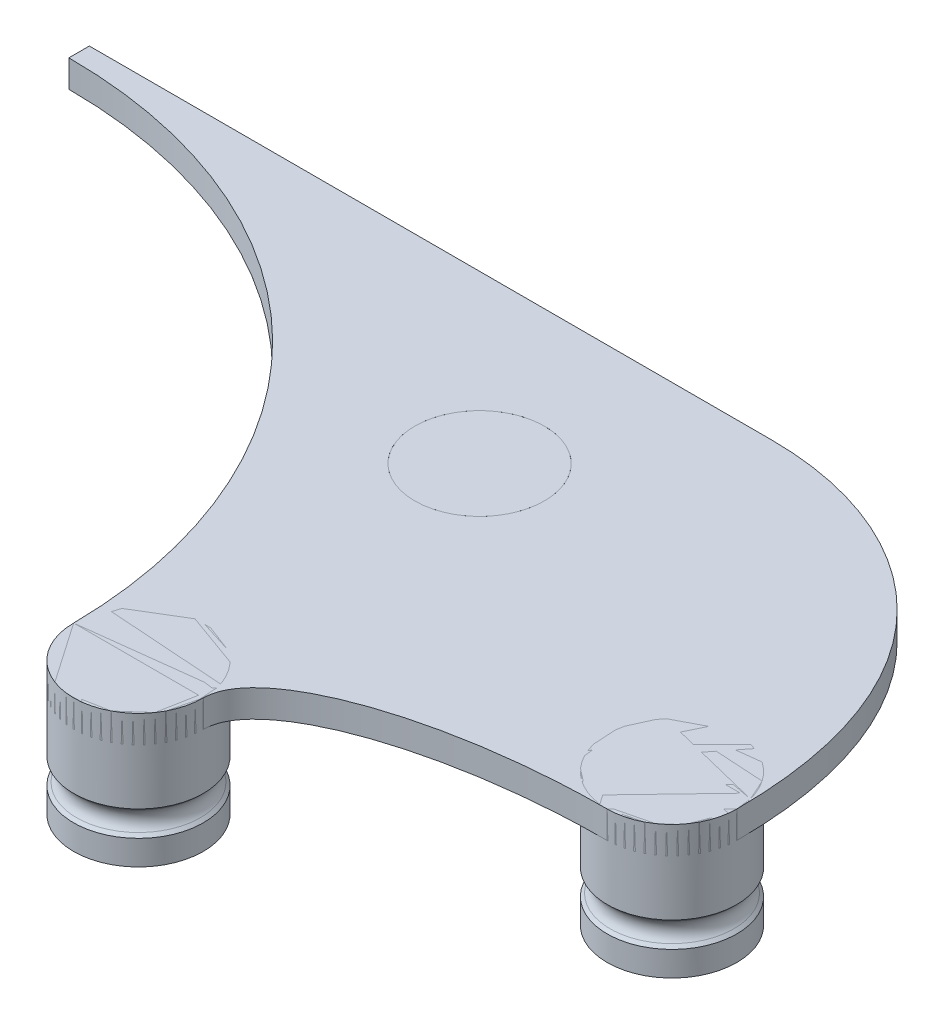
ISO-10303-21;
HEADER;
FILE_DESCRIPTION(('STEP AP214'),'2;1');
FILE_NAME('part.step','',(''),(''),'','','');
FILE_SCHEMA(('AUTOMOTIVE_DESIGN { 1 0 10303 214 1 1 1 1 }'));
ENDSEC;
DATA;
#1=APPLICATION_CONTEXT('core data for automotive mechanical design processes');
#2=APPLICATION_PROTOCOL_DEFINITION('international standard','automotive_design',2000,#1);
#3=PRODUCT_CONTEXT('',#1,'mechanical');
#4=PRODUCT('Part','Part','',(#3));
#5=PRODUCT_RELATED_PRODUCT_CATEGORY('part','',(#4));
#6=PRODUCT_DEFINITION_FORMATION('','',#4);
#7=PRODUCT_DEFINITION_CONTEXT('part definition',#1,'design');
#8=PRODUCT_DEFINITION('design','',#6,#7);
#9=PRODUCT_DEFINITION_SHAPE('','',#8);
#10=(LENGTH_UNIT() NAMED_UNIT(*) SI_UNIT(.MILLI.,.METRE.));
#11=(NAMED_UNIT(*) PLANE_ANGLE_UNIT() SI_UNIT($,.RADIAN.));
#12=(NAMED_UNIT(*) SI_UNIT($,.STERADIAN.) SOLID_ANGLE_UNIT());
#13=UNCERTAINTY_MEASURE_WITH_UNIT(LENGTH_MEASURE(1.E-05),#10,'distance_accuracy_value','');
#14=(GEOMETRIC_REPRESENTATION_CONTEXT(3) GLOBAL_UNCERTAINTY_ASSIGNED_CONTEXT((#13)) GLOBAL_UNIT_ASSIGNED_CONTEXT((#10,
#11,#12)) REPRESENTATION_CONTEXT('',''));
#15=CARTESIAN_POINT('',(0.,0.,0.));
#16=DIRECTION('',(0.,0.,1.));
#17=DIRECTION('',(1.,0.,0.));
#18=AXIS2_PLACEMENT_3D('',#15,#16,#17);
#19=CARTESIAN_POINT('',(-8.20000000000003,15.5,-49.4));
#20=CARTESIAN_POINT('',(13.9179916709351,15.5,-49.4));
#21=CARTESIAN_POINT('',(36.1,15.5,-33.7578396289594));
#22=CARTESIAN_POINT('',(36.1,15.5,0.));
#23=B_SPLINE_CURVE_WITH_KNOTS('',3,(#19,#20,#21,#22),.UNSPECIFIED.,.F.,.F.,(4,4),(0.,1.),.UNSPECIFIED.);
#24=DIRECTION('',(0.,1.,0.));
#25=VECTOR('',#24,1.);
#26=SURFACE_OF_LINEAR_EXTRUSION('',#23,#25);
#27=CARTESIAN_POINT('',(-8.20000000000003,19.5,-49.4));
#28=CARTESIAN_POINT('',(13.9179916709351,19.5,-49.4));
#29=CARTESIAN_POINT('',(36.1,19.5,-33.7578396289594));
#30=CARTESIAN_POINT('',(36.1,19.5,0.));
#31=B_SPLINE_CURVE_WITH_KNOTS('',3,(#27,#28,#29,#30),.UNSPECIFIED.,.F.,.F.,(4,4),(0.,1.),.UNSPECIFIED.);
#32=CARTESIAN_POINT('',(-8.20000000000002,19.5,-49.4));
#33=VERTEX_POINT('',#32);
#34=CARTESIAN_POINT('',(36.1,19.5,0.));
#35=VERTEX_POINT('',#34);
#36=EDGE_CURVE('E189',#33,#35,#31,.T.);
#37=ORIENTED_EDGE('',*,*,#36,.T.);
#38=DIRECTION('',(0.,1.,0.));
#39=VECTOR('',#38,1.);
#40=CARTESIAN_POINT('',(36.1,15.5,0.));
#41=LINE('',#40,#39);
#42=CARTESIAN_POINT('',(36.1,15.5,0.));
#43=VERTEX_POINT('',#42);
#44=EDGE_CURVE('E12',#43,#35,#41,.T.);
#45=ORIENTED_EDGE('',*,*,#44,.F.);
#46=CARTESIAN_POINT('',(-8.20000000000002,15.5,-49.4));
#47=VERTEX_POINT('',#46);
#48=EDGE_CURVE('E226',#47,#43,#23,.T.);
#49=ORIENTED_EDGE('',*,*,#48,.F.);
#50=DIRECTION('',(0.,1.,0.));
#51=VECTOR('',#50,1.);
#52=CARTESIAN_POINT('',(-8.20000000000002,15.5,-49.4));
#53=LINE('',#52,#51);
#54=EDGE_CURVE('E60',#47,#33,#53,.T.);
#55=ORIENTED_EDGE('',*,*,#54,.T.);
#56=EDGE_LOOP('',(#37,#45,#49,#55));
#57=FACE_BOUND('',#56,.T.);
#58=ADVANCED_FACE('F56',(#57),#26,.F.);
#59=CARTESIAN_POINT('',(26.6,15.5,0.));
#60=DIRECTION('',(0.,1.,0.));
#61=DIRECTION('',(0.,0.,1.));
#62=AXIS2_PLACEMENT_3D('',#59,#60,#61);
#63=CYLINDRICAL_SURFACE('',#62,9.5);
#64=CARTESIAN_POINT('',(26.6,19.5,0.));
#65=DIRECTION('',(0.,1.,0.));
#66=DIRECTION('',(0.,0.,1.));
#67=AXIS2_PLACEMENT_3D('',#64,#65,#66);
#68=CIRCLE('',#67,9.5);
#69=CARTESIAN_POINT('',(26.6,19.5,9.5));
#70=VERTEX_POINT('',#69);
#71=EDGE_CURVE('E106',#35,#70,#68,.F.);
#72=ORIENTED_EDGE('',*,*,#71,.T.);
#73=DIRECTION('',(0.,1.,0.));
#74=VECTOR('',#73,1.);
#75=CARTESIAN_POINT('',(26.6,15.5,9.5));
#76=LINE('',#75,#74);
#77=CARTESIAN_POINT('',(26.6,15.5,9.5));
#78=VERTEX_POINT('',#77);
#79=EDGE_CURVE('E67',#78,#70,#76,.T.);
#80=ORIENTED_EDGE('',*,*,#79,.F.);
#81=CARTESIAN_POINT('',(26.6,15.5,0.));
#82=DIRECTION('',(0.,1.,0.));
#83=DIRECTION('',(0.,0.,1.));
#84=AXIS2_PLACEMENT_3D('',#81,#82,#83);
#85=CIRCLE('',#84,9.5);
#86=EDGE_CURVE('E75',#43,#78,#85,.F.);
#87=ORIENTED_EDGE('',*,*,#86,.F.);
#88=ORIENTED_EDGE('',*,*,#44,.T.);
#89=EDGE_LOOP('',(#72,#80,#87,#88));
#90=FACE_BOUND('',#89,.T.);
#91=ADVANCED_FACE('F164',(#90),#63,.T.);
#92=CARTESIAN_POINT('',(-17.1,15.5,25.));
#93=CARTESIAN_POINT('',(-17.1,15.5,16.3922324920241));
#94=CARTESIAN_POINT('',(3.46901614860264,15.5,9.49999999999999));
#95=CARTESIAN_POINT('',(26.6000000000001,15.5,9.5));
#96=B_SPLINE_CURVE_WITH_KNOTS('',3,(#92,#93,#94,#95),.UNSPECIFIED.,.F.,.F.,(4,4),(0.,1.),.UNSPECIFIED.);
#97=DIRECTION('',(0.,1.,0.));
#98=VECTOR('',#97,1.);
#99=SURFACE_OF_LINEAR_EXTRUSION('',#96,#98);
#100=CARTESIAN_POINT('',(-17.1,19.5,25.));
#101=CARTESIAN_POINT('',(-17.1,19.5,16.3922324920241));
#102=CARTESIAN_POINT('',(3.46901614860264,19.5,9.49999999999999));
#103=CARTESIAN_POINT('',(26.6000000000001,19.5,9.5));
#104=B_SPLINE_CURVE_WITH_KNOTS('',3,(#100,#101,#102,#103),.UNSPECIFIED.,.F.,.F.,(4,4),(0.,1.),.UNSPECIFIED.);
#105=CARTESIAN_POINT('',(-17.1,19.5,25.));
#106=VERTEX_POINT('',#105);
#107=EDGE_CURVE('E127',#106,#70,#104,.T.);
#108=ORIENTED_EDGE('',*,*,#107,.F.);
#109=DIRECTION('',(0.,1.,0.));
#110=VECTOR('',#109,1.);
#111=CARTESIAN_POINT('',(-17.1,15.5,25.));
#112=LINE('',#111,#110);
#113=CARTESIAN_POINT('',(-17.1,15.5,25.));
#114=VERTEX_POINT('',#113);
#115=EDGE_CURVE('E123',#114,#106,#112,.T.);
#116=ORIENTED_EDGE('',*,*,#115,.F.);
#117=EDGE_CURVE('E126',#114,#78,#96,.T.);
#118=ORIENTED_EDGE('',*,*,#117,.T.);
#119=ORIENTED_EDGE('',*,*,#79,.T.);
#120=EDGE_LOOP('',(#108,#116,#118,#119));
#121=FACE_BOUND('',#120,.T.);
#122=ADVANCED_FACE('F125',(#121),#99,.T.);
#123=CARTESIAN_POINT('',(-26.6,15.5,25.));
#124=DIRECTION('',(0.,1.,0.));
#125=DIRECTION('',(0.,0.,1.));
#126=AXIS2_PLACEMENT_3D('',#123,#124,#125);
#127=CYLINDRICAL_SURFACE('',#126,9.5);
#128=CARTESIAN_POINT('',(-26.6,19.5,25.));
#129=DIRECTION('',(0.,1.,0.));
#130=DIRECTION('',(0.,0.,1.));
#131=AXIS2_PLACEMENT_3D('',#128,#129,#130);
#132=CIRCLE('',#131,9.5);
#133=CARTESIAN_POINT('',(-36.1,19.5,25.));
#134=VERTEX_POINT('',#133);
#135=EDGE_CURVE('E211',#134,#106,#132,.T.);
#136=ORIENTED_EDGE('',*,*,#135,.F.);
#137=DIRECTION('',(0.,1.,0.));
#138=VECTOR('',#137,1.);
#139=CARTESIAN_POINT('',(-36.1,15.5,25.));
#140=LINE('',#139,#138);
#141=CARTESIAN_POINT('',(-36.1,15.5,25.));
#142=VERTEX_POINT('',#141);
#143=EDGE_CURVE('E133',#142,#134,#140,.T.);
#144=ORIENTED_EDGE('',*,*,#143,.F.);
#145=CARTESIAN_POINT('',(-26.6,15.5,25.));
#146=DIRECTION('',(0.,1.,0.));
#147=DIRECTION('',(0.,0.,1.));
#148=AXIS2_PLACEMENT_3D('',#145,#146,#147);
#149=CIRCLE('',#148,9.5);
#150=EDGE_CURVE('E140',#142,#114,#149,.T.);
#151=ORIENTED_EDGE('',*,*,#150,.T.);
#152=ORIENTED_EDGE('',*,*,#115,.T.);
#153=EDGE_LOOP('',(#136,#144,#151,#152));
#154=FACE_BOUND('',#153,.T.);
#155=ADVANCED_FACE('F144',(#154),#127,.T.);
#156=CARTESIAN_POINT('',(-108.2,15.5,25.7034313725491));
#157=DIRECTION('',(0.,1.,0.));
#158=DIRECTION('',(0.,0.,1.));
#159=AXIS2_PLACEMENT_3D('',#156,#157,#158);
#160=CYLINDRICAL_SURFACE('',#159,72.103431372549);
#161=CARTESIAN_POINT('',(-108.2,19.5,25.7034313725491));
#162=DIRECTION('',(0.,1.,0.));
#163=DIRECTION('',(0.,0.,1.));
#164=AXIS2_PLACEMENT_3D('',#161,#162,#163);
#165=CIRCLE('',#164,72.103431372549);
#166=CARTESIAN_POINT('',(-108.2,19.5,-46.4));
#167=VERTEX_POINT('',#166);
#168=EDGE_CURVE('E207',#167,#134,#165,.F.);
#169=ORIENTED_EDGE('',*,*,#168,.F.);
#170=DIRECTION('',(0.,1.,0.));
#171=VECTOR('',#170,1.);
#172=CARTESIAN_POINT('',(-108.2,15.5,-46.4));
#173=LINE('',#172,#171);
#174=CARTESIAN_POINT('',(-108.2,15.5,-46.4));
#175=VERTEX_POINT('',#174);
#176=EDGE_CURVE('E232',#175,#167,#173,.T.);
#177=ORIENTED_EDGE('',*,*,#176,.F.);
#178=CARTESIAN_POINT('',(-108.2,15.5,25.7034313725491));
#179=DIRECTION('',(0.,1.,0.));
#180=DIRECTION('',(0.,0.,1.));
#181=AXIS2_PLACEMENT_3D('',#178,#179,#180);
#182=CIRCLE('',#181,72.103431372549);
#183=EDGE_CURVE('E146',#175,#142,#182,.F.);
#184=ORIENTED_EDGE('',*,*,#183,.T.);
#185=ORIENTED_EDGE('',*,*,#143,.T.);
#186=EDGE_LOOP('',(#169,#177,#184,#185));
#187=FACE_BOUND('',#186,.T.);
#188=ADVANCED_FACE('F168',(#187),#160,.F.);
#189=CARTESIAN_POINT('',(-108.2,15.5,0.));
#190=DIRECTION('',(1.,0.,0.));
#191=DIRECTION('',(0.,0.,-1.));
#192=AXIS2_PLACEMENT_3D('',#189,#190,#191);
#193=PLANE('',#192);
#194=DIRECTION('',(0.,0.,-1.));
#195=VECTOR('',#194,1.);
#196=CARTESIAN_POINT('',(-108.2,19.5,0.));
#197=LINE('',#196,#195);
#198=CARTESIAN_POINT('',(-108.2,19.5,-49.4));
#199=VERTEX_POINT('',#198);
#200=EDGE_CURVE('E195',#167,#199,#197,.T.);
#201=ORIENTED_EDGE('',*,*,#200,.T.);
#202=DIRECTION('',(0.,1.,0.));
#203=VECTOR('',#202,1.);
#204=CARTESIAN_POINT('',(-108.2,15.5,-49.4));
#205=LINE('',#204,#203);
#206=CARTESIAN_POINT('',(-108.2,15.5,-49.4));
#207=VERTEX_POINT('',#206);
#208=EDGE_CURVE('E234',#207,#199,#205,.T.);
#209=ORIENTED_EDGE('',*,*,#208,.F.);
#210=DIRECTION('',(0.,0.,-1.));
#211=VECTOR('',#210,1.);
#212=CARTESIAN_POINT('',(-108.2,15.5,0.));
#213=LINE('',#212,#211);
#214=EDGE_CURVE('E149',#175,#207,#213,.T.);
#215=ORIENTED_EDGE('',*,*,#214,.F.);
#216=ORIENTED_EDGE('',*,*,#176,.T.);
#217=EDGE_LOOP('',(#201,#209,#215,#216));
#218=FACE_BOUND('',#217,.T.);
#219=ADVANCED_FACE('F171',(#218),#193,.F.);
#220=CARTESIAN_POINT('',(0.,15.5,-49.4));
#221=DIRECTION('',(0.,0.,-1.));
#222=DIRECTION('',(-1.,0.,0.));
#223=AXIS2_PLACEMENT_3D('',#220,#221,#222);
#224=PLANE('',#223);
#225=DIRECTION('',(-1.,0.,0.));
#226=VECTOR('',#225,1.);
#227=CARTESIAN_POINT('',(0.,19.5,-49.4));
#228=LINE('',#227,#226);
#229=EDGE_CURVE('E192',#33,#199,#228,.T.);
#230=ORIENTED_EDGE('',*,*,#229,.F.);
#231=ORIENTED_EDGE('',*,*,#54,.F.);
#232=DIRECTION('',(-1.,0.,0.));
#233=VECTOR('',#232,1.);
#234=CARTESIAN_POINT('',(0.,15.5,-49.4));
#235=LINE('',#234,#233);
#236=EDGE_CURVE('E327',#47,#207,#235,.T.);
#237=ORIENTED_EDGE('',*,*,#236,.T.);
#238=ORIENTED_EDGE('',*,*,#208,.T.);
#239=EDGE_LOOP('',(#230,#231,#237,#238));
#240=FACE_BOUND('',#239,.T.);
#241=ADVANCED_FACE('F174',(#240),#224,.T.);
#242=CARTESIAN_POINT('',(-26.6,15.5,-25.));
#243=DIRECTION('',(0.,1.,0.));
#244=DIRECTION('',(0.,0.,1.));
#245=AXIS2_PLACEMENT_3D('',#242,#243,#244);
#246=CYLINDRICAL_SURFACE('',#245,9.50000000000001);
#247=CARTESIAN_POINT('',(-26.6,15.5,-25.));
#248=DIRECTION('',(0.,1.,0.));
#249=DIRECTION('',(0.,0.,1.));
#250=AXIS2_PLACEMENT_3D('',#247,#248,#249);
#251=CIRCLE('',#250,9.50000000000001);
#252=CARTESIAN_POINT('',(-26.6,15.5,-15.5));
#253=VERTEX_POINT('',#252);
#254=EDGE_CURVE('E199',#253,#253,#251,.T.);
#255=ORIENTED_EDGE('',*,*,#254,.F.);
#256=EDGE_LOOP('',(#255));
#257=FACE_BOUND('',#256,.T.);
#258=CARTESIAN_POINT('',(-26.6,19.5,-25.));
#259=DIRECTION('',(0.,1.,0.));
#260=DIRECTION('',(0.,0.,1.));
#261=AXIS2_PLACEMENT_3D('',#258,#259,#260);
#262=CIRCLE('',#261,9.50000000000001);
#263=CARTESIAN_POINT('',(-26.6,19.5,-15.5));
#264=VERTEX_POINT('',#263);
#265=EDGE_CURVE('E223',#264,#264,#262,.T.);
#266=ORIENTED_EDGE('',*,*,#265,.T.);
#267=EDGE_LOOP('',(#266));
#268=FACE_BOUND('',#267,.T.);
#269=ADVANCED_FACE('F177',(#257,#268),#246,.F.);
#270=CARTESIAN_POINT('',(0.,15.5,0.));
#271=DIRECTION('',(0.,1.,0.));
#272=DIRECTION('',(0.,0.,1.));
#273=AXIS2_PLACEMENT_3D('',#270,#271,#272);
#274=PLANE('',#273);
#275=ORIENTED_EDGE('',*,*,#48,.T.);
#276=ORIENTED_EDGE('',*,*,#86,.T.);
#277=ORIENTED_EDGE('',*,*,#117,.F.);
#278=ORIENTED_EDGE('',*,*,#150,.F.);
#279=ORIENTED_EDGE('',*,*,#183,.F.);
#280=ORIENTED_EDGE('',*,*,#214,.T.);
#281=ORIENTED_EDGE('',*,*,#236,.F.);
#282=EDGE_LOOP('',(#275,#276,#277,#278,#279,#280,#281));
#283=FACE_BOUND('',#282,.T.);
#284=ORIENTED_EDGE('',*,*,#254,.T.);
#285=EDGE_LOOP('',(#284));
#286=FACE_BOUND('',#285,.T.);
#287=ADVANCED_FACE('F137',(#283,#286),#274,.F.);
#288=CARTESIAN_POINT('',(0.,19.5,0.));
#289=DIRECTION('',(0.,1.,0.));
#290=DIRECTION('',(0.,0.,1.));
#291=AXIS2_PLACEMENT_3D('',#288,#289,#290);
#292=PLANE('',#291);
#293=ORIENTED_EDGE('',*,*,#36,.F.);
#294=ORIENTED_EDGE('',*,*,#229,.T.);
#295=ORIENTED_EDGE('',*,*,#200,.F.);
#296=ORIENTED_EDGE('',*,*,#168,.T.);
#297=ORIENTED_EDGE('',*,*,#135,.T.);
#298=ORIENTED_EDGE('',*,*,#107,.T.);
#299=ORIENTED_EDGE('',*,*,#71,.F.);
#300=EDGE_LOOP('',(#293,#294,#295,#296,#297,#298,#299));
#301=FACE_BOUND('',#300,.T.);
#302=ORIENTED_EDGE('',*,*,#265,.F.);
#303=EDGE_LOOP('',(#302));
#304=FACE_BOUND('',#303,.T.);
#305=ADVANCED_FACE('F245',(#301,#304),#292,.T.);
#306=CLOSED_SHELL('',(#58,#91,#122,#155,#188,#219,#241,#269,#287,#305));
#307=MANIFOLD_SOLID_BREP('B2',#306);
#308=CARTESIAN_POINT('',(-26.6,11.,25.));
#309=DIRECTION('',(0.,-1.,0.));
#310=DIRECTION('',(0.,0.,-1.));
#311=AXIS2_PLACEMENT_3D('',#308,#309,#310);
#312=CYLINDRICAL_SURFACE('',#311,9.5);
#313=CARTESIAN_POINT('',(-26.6,3.63621753619449,25.));
#314=DIRECTION('',(0.,-1.,0.));
#315=DIRECTION('',(0.,0.,-1.));
#316=AXIS2_PLACEMENT_3D('',#313,#314,#315);
#317=CIRCLE('',#316,9.5);
#318=CARTESIAN_POINT('',(-26.6,3.63621753619449,15.5));
#319=VERTEX_POINT('',#318);
#320=EDGE_CURVE('E362',#319,#319,#317,.T.);
#321=ORIENTED_EDGE('',*,*,#320,.T.);
#322=EDGE_LOOP('',(#321));
#323=FACE_BOUND('',#322,.T.);
#324=CARTESIAN_POINT('',(-26.6,0.,25.));
#325=DIRECTION('',(0.,1.,0.));
#326=DIRECTION('',(0.,0.,1.));
#327=AXIS2_PLACEMENT_3D('',#324,#325,#326);
#328=CIRCLE('',#327,9.5);
#329=CARTESIAN_POINT('',(-26.6,0.,34.5));
#330=VERTEX_POINT('',#329);
#331=EDGE_CURVE('E55',#330,#330,#328,.T.);
#332=ORIENTED_EDGE('',*,*,#331,.T.);
#333=EDGE_LOOP('',(#332));
#334=FACE_BOUND('',#333,.T.);
#335=ADVANCED_FACE('F352',(#323,#334),#312,.T.);
#336=CARTESIAN_POINT('',(-53.2,0.,25.));
#337=DIRECTION('',(0.,1.,0.));
#338=DIRECTION('',(0.,0.,1.));
#339=AXIS2_PLACEMENT_3D('',#336,#337,#338);
#340=PLANE('',#339);
#341=ORIENTED_EDGE('',*,*,#331,.F.);
#342=EDGE_LOOP('',(#341));
#343=FACE_BOUND('',#342,.T.);
#344=ADVANCED_FACE('F394',(#343),#340,.F.);
#345=CARTESIAN_POINT('',(-26.6,5.5,25.));
#346=DIRECTION('',(0.,-1.,0.));
#347=DIRECTION('',(0.,0.,-1.));
#348=AXIS2_PLACEMENT_3D('',#345,#346,#347);
#349=TOROIDAL_SURFACE('',#348,10.5,2.025);
#350=CARTESIAN_POINT('',(-26.6,6.93189123190275,25.));
#351=DIRECTION('',(0.,-1.,0.));
#352=DIRECTION('',(0.,0.,-1.));
#353=AXIS2_PLACEMENT_3D('',#350,#351,#352);
#354=CIRCLE('',#353,9.06810876809724);
#355=CARTESIAN_POINT('',(-26.6,6.93189123190275,15.9318912319027));
#356=VERTEX_POINT('',#355);
#357=EDGE_CURVE('E371',#356,#356,#354,.T.);
#358=ORIENTED_EDGE('',*,*,#357,.T.);
#359=EDGE_LOOP('',(#358));
#360=FACE_BOUND('',#359,.T.);
#361=CARTESIAN_POINT('',(-26.6,4.06810876809725,25.));
#362=DIRECTION('',(0.,-1.,0.));
#363=DIRECTION('',(0.,0.,-1.));
#364=AXIS2_PLACEMENT_3D('',#361,#362,#363);
#365=CIRCLE('',#364,9.06810876809724);
#366=CARTESIAN_POINT('',(-26.6,4.06810876809725,15.9318912319027));
#367=VERTEX_POINT('',#366);
#368=EDGE_CURVE('E358',#367,#367,#365,.T.);
#369=ORIENTED_EDGE('',*,*,#368,.F.);
#370=EDGE_LOOP('',(#369));
#371=FACE_BOUND('',#370,.T.);
#372=ADVANCED_FACE('F399',(#360,#371),#349,.F.);
#373=CARTESIAN_POINT('',(-26.6,4.06810876809725,25.));
#374=DIRECTION('',(0.,-1.,0.));
#375=DIRECTION('',(0.,0.,-1.));
#376=AXIS2_PLACEMENT_3D('',#373,#374,#375);
#377=CONICAL_SURFACE('',#376,9.06810876809724,0.785398163397444);
#378=ORIENTED_EDGE('',*,*,#320,.F.);
#379=EDGE_LOOP('',(#378));
#380=FACE_BOUND('',#379,.T.);
#381=ORIENTED_EDGE('',*,*,#368,.T.);
#382=EDGE_LOOP('',(#381));
#383=FACE_BOUND('',#382,.T.);
#384=ADVANCED_FACE('F389',(#380,#383),#377,.T.);
#385=CARTESIAN_POINT('',(-26.6,6.93189123190275,25.));
#386=DIRECTION('',(0.,1.,0.));
#387=DIRECTION('',(0.,0.,1.));
#388=AXIS2_PLACEMENT_3D('',#385,#386,#387);
#389=CONICAL_SURFACE('',#388,9.06810876809724,0.785398163397452);
#390=CARTESIAN_POINT('',(-26.6,7.36378246380551,25.));
#391=DIRECTION('',(0.,-1.,0.));
#392=DIRECTION('',(0.,0.,-1.));
#393=AXIS2_PLACEMENT_3D('',#390,#391,#392);
#394=CIRCLE('',#393,9.50000000000001);
#395=CARTESIAN_POINT('',(-26.6,7.36378246380551,15.5));
#396=VERTEX_POINT('',#395);
#397=EDGE_CURVE('E366',#396,#396,#394,.T.);
#398=ORIENTED_EDGE('',*,*,#397,.T.);
#399=EDGE_LOOP('',(#398));
#400=FACE_BOUND('',#399,.T.);
#401=ORIENTED_EDGE('',*,*,#357,.F.);
#402=EDGE_LOOP('',(#401));
#403=FACE_BOUND('',#402,.T.);
#404=ADVANCED_FACE('F382',(#400,#403),#389,.T.);
#405=ORIENTED_EDGE('',*,*,#397,.F.);
#406=EDGE_LOOP('',(#405));
#407=FACE_BOUND('',#406,.T.);
#408=CARTESIAN_POINT('',(-26.6,19.5,25.));
#409=DIRECTION('',(0.,1.,0.));
#410=DIRECTION('',(0.,0.,1.));
#411=AXIS2_PLACEMENT_3D('',#408,#409,#410);
#412=CIRCLE('',#411,9.5);
#413=CARTESIAN_POINT('',(-26.6,19.5,34.5));
#414=VERTEX_POINT('',#413);
#415=EDGE_CURVE('E374',#414,#414,#412,.T.);
#416=ORIENTED_EDGE('',*,*,#415,.F.);
#417=EDGE_LOOP('',(#416));
#418=FACE_BOUND('',#417,.T.);
#419=ADVANCED_FACE('F380',(#407,#418),#312,.T.);
#420=CARTESIAN_POINT('',(-26.6,19.5,25.));
#421=DIRECTION('',(0.,1.,0.));
#422=DIRECTION('',(0.,0.,1.));
#423=AXIS2_PLACEMENT_3D('',#420,#421,#422);
#424=PLANE('',#423);
#425=ORIENTED_EDGE('',*,*,#415,.T.);
#426=EDGE_LOOP('',(#425));
#427=FACE_BOUND('',#426,.T.);
#428=ADVANCED_FACE('F378',(#427),#424,.T.);
#429=CLOSED_SHELL('',(#335,#344,#372,#384,#404,#419,#428));
#430=MANIFOLD_SOLID_BREP('B6',#429);
#431=CARTESIAN_POINT('',(-26.6,11.,-25.));
#432=DIRECTION('',(0.,-1.,0.));
#433=DIRECTION('',(0.,0.,-1.));
#434=AXIS2_PLACEMENT_3D('',#431,#432,#433);
#435=CYLINDRICAL_SURFACE('',#434,9.5);
#436=CARTESIAN_POINT('',(-26.6,3.63621753619449,-25.));
#437=DIRECTION('',(0.,-1.,0.));
#438=DIRECTION('',(0.,0.,-1.));
#439=AXIS2_PLACEMENT_3D('',#436,#437,#438);
#440=CIRCLE('',#439,9.5);
#441=CARTESIAN_POINT('',(-26.6,3.63621753619449,-34.5));
#442=VERTEX_POINT('',#441);
#443=EDGE_CURVE('E486',#442,#442,#440,.T.);
#444=ORIENTED_EDGE('',*,*,#443,.T.);
#445=EDGE_LOOP('',(#444));
#446=FACE_BOUND('',#445,.T.);
#447=CARTESIAN_POINT('',(-26.6,0.,-25.));
#448=DIRECTION('',(0.,1.,0.));
#449=DIRECTION('',(0.,0.,1.));
#450=AXIS2_PLACEMENT_3D('',#447,#448,#449);
#451=CIRCLE('',#450,9.5);
#452=CARTESIAN_POINT('',(-26.6,0.,-15.5));
#453=VERTEX_POINT('',#452);
#454=EDGE_CURVE('E351',#453,#453,#451,.T.);
#455=ORIENTED_EDGE('',*,*,#454,.T.);
#456=EDGE_LOOP('',(#455));
#457=FACE_BOUND('',#456,.T.);
#458=ADVANCED_FACE('F476',(#446,#457),#435,.T.);
#459=CARTESIAN_POINT('',(-53.2,0.,-25.));
#460=DIRECTION('',(0.,1.,0.));
#461=DIRECTION('',(0.,0.,1.));
#462=AXIS2_PLACEMENT_3D('',#459,#460,#461);
#463=PLANE('',#462);
#464=ORIENTED_EDGE('',*,*,#454,.F.);
#465=EDGE_LOOP('',(#464));
#466=FACE_BOUND('',#465,.T.);
#467=ADVANCED_FACE('F518',(#466),#463,.F.);
#468=CARTESIAN_POINT('',(-26.6,5.5,-25.));
#469=DIRECTION('',(0.,-1.,0.));
#470=DIRECTION('',(0.,0.,-1.));
#471=AXIS2_PLACEMENT_3D('',#468,#469,#470);
#472=TOROIDAL_SURFACE('',#471,10.5,2.025);
#473=CARTESIAN_POINT('',(-26.6,6.93189123190275,-25.));
#474=DIRECTION('',(0.,-1.,0.));
#475=DIRECTION('',(0.,0.,-1.));
#476=AXIS2_PLACEMENT_3D('',#473,#474,#475);
#477=CIRCLE('',#476,9.06810876809724);
#478=CARTESIAN_POINT('',(-26.6,6.93189123190275,-34.0681087680973));
#479=VERTEX_POINT('',#478);
#480=EDGE_CURVE('E495',#479,#479,#477,.T.);
#481=ORIENTED_EDGE('',*,*,#480,.T.);
#482=EDGE_LOOP('',(#481));
#483=FACE_BOUND('',#482,.T.);
#484=CARTESIAN_POINT('',(-26.6,4.06810876809725,-25.));
#485=DIRECTION('',(0.,-1.,0.));
#486=DIRECTION('',(0.,0.,-1.));
#487=AXIS2_PLACEMENT_3D('',#484,#485,#486);
#488=CIRCLE('',#487,9.06810876809724);
#489=CARTESIAN_POINT('',(-26.6,4.06810876809725,-34.0681087680973));
#490=VERTEX_POINT('',#489);
#491=EDGE_CURVE('E482',#490,#490,#488,.T.);
#492=ORIENTED_EDGE('',*,*,#491,.F.);
#493=EDGE_LOOP('',(#492));
#494=FACE_BOUND('',#493,.T.);
#495=ADVANCED_FACE('F523',(#483,#494),#472,.F.);
#496=CARTESIAN_POINT('',(-26.6,4.06810876809725,-25.));
#497=DIRECTION('',(0.,-1.,0.));
#498=DIRECTION('',(0.,0.,-1.));
#499=AXIS2_PLACEMENT_3D('',#496,#497,#498);
#500=CONICAL_SURFACE('',#499,9.06810876809724,0.785398163397444);
#501=ORIENTED_EDGE('',*,*,#443,.F.);
#502=EDGE_LOOP('',(#501));
#503=FACE_BOUND('',#502,.T.);
#504=ORIENTED_EDGE('',*,*,#491,.T.);
#505=EDGE_LOOP('',(#504));
#506=FACE_BOUND('',#505,.T.);
#507=ADVANCED_FACE('F513',(#503,#506),#500,.T.);
#508=CARTESIAN_POINT('',(-26.6,6.93189123190275,-25.));
#509=DIRECTION('',(0.,1.,0.));
#510=DIRECTION('',(0.,0.,1.));
#511=AXIS2_PLACEMENT_3D('',#508,#509,#510);
#512=CONICAL_SURFACE('',#511,9.06810876809724,0.785398163397452);
#513=CARTESIAN_POINT('',(-26.6,7.36378246380551,-25.));
#514=DIRECTION('',(0.,-1.,0.));
#515=DIRECTION('',(0.,0.,-1.));
#516=AXIS2_PLACEMENT_3D('',#513,#514,#515);
#517=CIRCLE('',#516,9.50000000000001);
#518=CARTESIAN_POINT('',(-26.6,7.36378246380551,-34.5));
#519=VERTEX_POINT('',#518);
#520=EDGE_CURVE('E490',#519,#519,#517,.T.);
#521=ORIENTED_EDGE('',*,*,#520,.T.);
#522=EDGE_LOOP('',(#521));
#523=FACE_BOUND('',#522,.T.);
#524=ORIENTED_EDGE('',*,*,#480,.F.);
#525=EDGE_LOOP('',(#524));
#526=FACE_BOUND('',#525,.T.);
#527=ADVANCED_FACE('F506',(#523,#526),#512,.T.);
#528=ORIENTED_EDGE('',*,*,#520,.F.);
#529=EDGE_LOOP('',(#528));
#530=FACE_BOUND('',#529,.T.);
#531=CARTESIAN_POINT('',(-26.6,19.5,-25.));
#532=DIRECTION('',(0.,1.,0.));
#533=DIRECTION('',(0.,0.,1.));
#534=AXIS2_PLACEMENT_3D('',#531,#532,#533);
#535=CIRCLE('',#534,9.50000000000001);
#536=CARTESIAN_POINT('',(-26.6,19.5,-15.5));
#537=VERTEX_POINT('',#536);
#538=EDGE_CURVE('E498',#537,#537,#535,.T.);
#539=ORIENTED_EDGE('',*,*,#538,.F.);
#540=EDGE_LOOP('',(#539));
#541=FACE_BOUND('',#540,.T.);
#542=ADVANCED_FACE('F504',(#530,#541),#435,.T.);
#543=CARTESIAN_POINT('',(-26.6,19.5,-25.));
#544=DIRECTION('',(0.,1.,0.));
#545=DIRECTION('',(0.,0.,1.));
#546=AXIS2_PLACEMENT_3D('',#543,#544,#545);
#547=PLANE('',#546);
#548=ORIENTED_EDGE('',*,*,#538,.T.);
#549=EDGE_LOOP('',(#548));
#550=FACE_BOUND('',#549,.T.);
#551=ADVANCED_FACE('F502',(#550),#547,.T.);
#552=CLOSED_SHELL('',(#458,#467,#495,#507,#527,#542,#551));
#553=MANIFOLD_SOLID_BREP('B50',#552);
#554=CARTESIAN_POINT('',(26.6,11.,0.));
#555=DIRECTION('',(0.,-1.,0.));
#556=DIRECTION('',(0.,0.,-1.));
#557=AXIS2_PLACEMENT_3D('',#554,#555,#556);
#558=CYLINDRICAL_SURFACE('',#557,9.5);
#559=CARTESIAN_POINT('',(26.6,3.63621753619449,0.));
#560=DIRECTION('',(0.,-1.,0.));
#561=DIRECTION('',(0.,0.,-1.));
#562=AXIS2_PLACEMENT_3D('',#559,#560,#561);
#563=CIRCLE('',#562,9.5);
#564=CARTESIAN_POINT('',(26.6,3.63621753619449,-9.5));
#565=VERTEX_POINT('',#564);
#566=EDGE_CURVE('E603',#565,#565,#563,.T.);
#567=ORIENTED_EDGE('',*,*,#566,.T.);
#568=EDGE_LOOP('',(#567));
#569=FACE_BOUND('',#568,.T.);
#570=CARTESIAN_POINT('',(26.6,0.,0.));
#571=DIRECTION('',(0.,1.,0.));
#572=DIRECTION('',(0.,0.,1.));
#573=AXIS2_PLACEMENT_3D('',#570,#571,#572);
#574=CIRCLE('',#573,9.5);
#575=CARTESIAN_POINT('',(26.6,0.,9.5));
#576=VERTEX_POINT('',#575);
#577=EDGE_CURVE('E475',#576,#576,#574,.T.);
#578=ORIENTED_EDGE('',*,*,#577,.T.);
#579=EDGE_LOOP('',(#578));
#580=FACE_BOUND('',#579,.T.);
#581=ADVANCED_FACE('F593',(#569,#580),#558,.T.);
#582=CARTESIAN_POINT('',(0.,0.,0.));
#583=DIRECTION('',(0.,1.,0.));
#584=DIRECTION('',(0.,0.,1.));
#585=AXIS2_PLACEMENT_3D('',#582,#583,#584);
#586=PLANE('',#585);
#587=ORIENTED_EDGE('',*,*,#577,.F.);
#588=EDGE_LOOP('',(#587));
#589=FACE_BOUND('',#588,.T.);
#590=ADVANCED_FACE('F635',(#589),#586,.F.);
#591=CARTESIAN_POINT('',(26.6,5.5,0.));
#592=DIRECTION('',(0.,-1.,0.));
#593=DIRECTION('',(0.,0.,-1.));
#594=AXIS2_PLACEMENT_3D('',#591,#592,#593);
#595=TOROIDAL_SURFACE('',#594,10.5,2.025);
#596=CARTESIAN_POINT('',(26.6,6.93189123190275,0.));
#597=DIRECTION('',(0.,-1.,0.));
#598=DIRECTION('',(0.,0.,-1.));
#599=AXIS2_PLACEMENT_3D('',#596,#597,#598);
#600=CIRCLE('',#599,9.06810876809724);
#601=CARTESIAN_POINT('',(26.6,6.93189123190275,-9.06810876809724));
#602=VERTEX_POINT('',#601);
#603=EDGE_CURVE('E612',#602,#602,#600,.T.);
#604=ORIENTED_EDGE('',*,*,#603,.T.);
#605=EDGE_LOOP('',(#604));
#606=FACE_BOUND('',#605,.T.);
#607=CARTESIAN_POINT('',(26.6,4.06810876809725,0.));
#608=DIRECTION('',(0.,-1.,0.));
#609=DIRECTION('',(0.,0.,-1.));
#610=AXIS2_PLACEMENT_3D('',#607,#608,#609);
#611=CIRCLE('',#610,9.06810876809724);
#612=CARTESIAN_POINT('',(26.6,4.06810876809725,-9.06810876809724));
#613=VERTEX_POINT('',#612);
#614=EDGE_CURVE('E599',#613,#613,#611,.T.);
#615=ORIENTED_EDGE('',*,*,#614,.F.);
#616=EDGE_LOOP('',(#615));
#617=FACE_BOUND('',#616,.T.);
#618=ADVANCED_FACE('F640',(#606,#617),#595,.F.);
#619=CARTESIAN_POINT('',(26.6,4.06810876809725,0.));
#620=DIRECTION('',(0.,-1.,0.));
#621=DIRECTION('',(0.,0.,-1.));
#622=AXIS2_PLACEMENT_3D('',#619,#620,#621);
#623=CONICAL_SURFACE('',#622,9.06810876809724,0.785398163397444);
#624=ORIENTED_EDGE('',*,*,#566,.F.);
#625=EDGE_LOOP('',(#624));
#626=FACE_BOUND('',#625,.T.);
#627=ORIENTED_EDGE('',*,*,#614,.T.);
#628=EDGE_LOOP('',(#627));
#629=FACE_BOUND('',#628,.T.);
#630=ADVANCED_FACE('F630',(#626,#629),#623,.T.);
#631=CARTESIAN_POINT('',(26.6,6.93189123190275,0.));
#632=DIRECTION('',(0.,1.,0.));
#633=DIRECTION('',(0.,0.,1.));
#634=AXIS2_PLACEMENT_3D('',#631,#632,#633);
#635=CONICAL_SURFACE('',#634,9.06810876809724,0.785398163397452);
#636=CARTESIAN_POINT('',(26.6,7.36378246380551,0.));
#637=DIRECTION('',(0.,-1.,0.));
#638=DIRECTION('',(0.,0.,-1.));
#639=AXIS2_PLACEMENT_3D('',#636,#637,#638);
#640=CIRCLE('',#639,9.50000000000001);
#641=CARTESIAN_POINT('',(26.6,7.36378246380551,-9.50000000000001));
#642=VERTEX_POINT('',#641);
#643=EDGE_CURVE('E607',#642,#642,#640,.T.);
#644=ORIENTED_EDGE('',*,*,#643,.T.);
#645=EDGE_LOOP('',(#644));
#646=FACE_BOUND('',#645,.T.);
#647=ORIENTED_EDGE('',*,*,#603,.F.);
#648=EDGE_LOOP('',(#647));
#649=FACE_BOUND('',#648,.T.);
#650=ADVANCED_FACE('F623',(#646,#649),#635,.T.);
#651=ORIENTED_EDGE('',*,*,#643,.F.);
#652=EDGE_LOOP('',(#651));
#653=FACE_BOUND('',#652,.T.);
#654=CARTESIAN_POINT('',(26.6,19.5,0.));
#655=DIRECTION('',(0.,1.,0.));
#656=DIRECTION('',(0.,0.,1.));
#657=AXIS2_PLACEMENT_3D('',#654,#655,#656);
#658=CIRCLE('',#657,9.5);
#659=CARTESIAN_POINT('',(26.6,19.5,9.5));
#660=VERTEX_POINT('',#659);
#661=EDGE_CURVE('E615',#660,#660,#658,.T.);
#662=ORIENTED_EDGE('',*,*,#661,.F.);
#663=EDGE_LOOP('',(#662));
#664=FACE_BOUND('',#663,.T.);
#665=ADVANCED_FACE('F621',(#653,#664),#558,.T.);
#666=CARTESIAN_POINT('',(26.6,19.5,0.));
#667=DIRECTION('',(0.,1.,0.));
#668=DIRECTION('',(0.,0.,1.));
#669=AXIS2_PLACEMENT_3D('',#666,#667,#668);
#670=PLANE('',#669);
#671=ORIENTED_EDGE('',*,*,#661,.T.);
#672=EDGE_LOOP('',(#671));
#673=FACE_BOUND('',#672,.T.);
#674=ADVANCED_FACE('F619',(#673),#670,.T.);
#675=CLOSED_SHELL('',(#581,#590,#618,#630,#650,#665,#674));
#676=MANIFOLD_SOLID_BREP('B346',#675);
#677=ADVANCED_BREP_SHAPE_REPRESENTATION('',(#18,#307,#430,#553,#676),#14);
#678=SHAPE_DEFINITION_REPRESENTATION(#9,#677);
ENDSEC;
END-ISO-10303-21;
